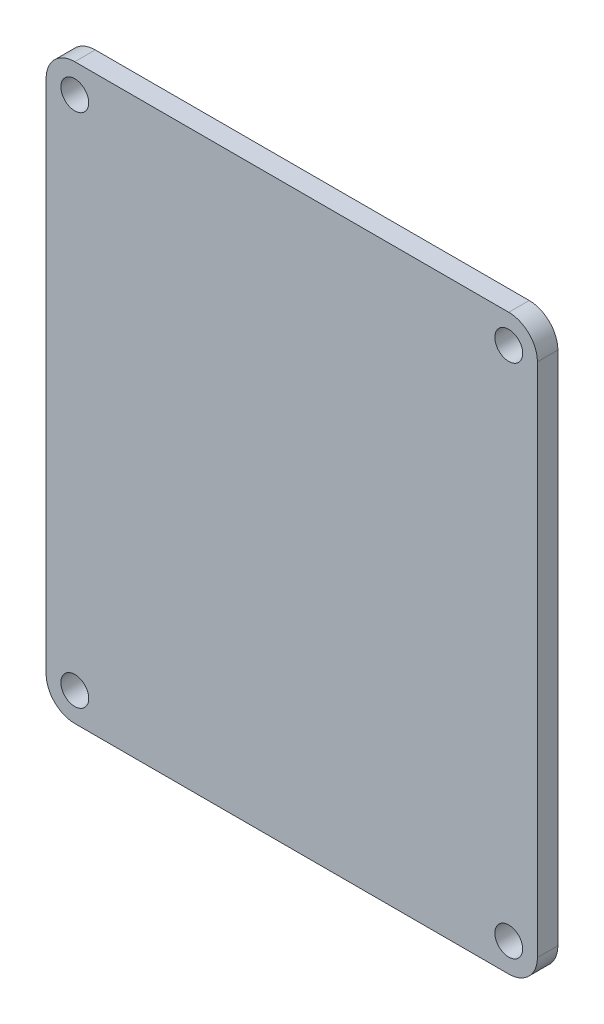
ISO-10303-21;
HEADER;
FILE_DESCRIPTION(('STEP AP214'),'2;1');
FILE_NAME('part.step','',(''),(''),'','','');
FILE_SCHEMA(('AUTOMOTIVE_DESIGN { 1 0 10303 214 1 1 1 1 }'));
ENDSEC;
DATA;
#1=APPLICATION_CONTEXT('core data for automotive mechanical design processes');
#2=APPLICATION_PROTOCOL_DEFINITION('international standard','automotive_design',2000,#1);
#3=PRODUCT_CONTEXT('',#1,'mechanical');
#4=PRODUCT('Part','Part','',(#3));
#5=PRODUCT_RELATED_PRODUCT_CATEGORY('part','',(#4));
#6=PRODUCT_DEFINITION_FORMATION('','',#4);
#7=PRODUCT_DEFINITION_CONTEXT('part definition',#1,'design');
#8=PRODUCT_DEFINITION('design','',#6,#7);
#9=PRODUCT_DEFINITION_SHAPE('','',#8);
#10=(LENGTH_UNIT() NAMED_UNIT(*) SI_UNIT(.MILLI.,.METRE.));
#11=(NAMED_UNIT(*) PLANE_ANGLE_UNIT() SI_UNIT($,.RADIAN.));
#12=(NAMED_UNIT(*) SI_UNIT($,.STERADIAN.) SOLID_ANGLE_UNIT());
#13=UNCERTAINTY_MEASURE_WITH_UNIT(LENGTH_MEASURE(1.E-05),#10,'distance_accuracy_value','');
#14=(GEOMETRIC_REPRESENTATION_CONTEXT(3) GLOBAL_UNCERTAINTY_ASSIGNED_CONTEXT((#13)) GLOBAL_UNIT_ASSIGNED_CONTEXT((#10,
#11,#12)) REPRESENTATION_CONTEXT('',''));
#15=CARTESIAN_POINT('',(0.,0.,0.));
#16=DIRECTION('',(0.,0.,1.));
#17=DIRECTION('',(1.,0.,0.));
#18=AXIS2_PLACEMENT_3D('',#15,#16,#17);
#19=CARTESIAN_POINT('',(-26.5,-31.5,2.5));
#20=DIRECTION('',(0.,0.,-1.));
#21=DIRECTION('',(-1.,0.,0.));
#22=AXIS2_PLACEMENT_3D('',#19,#20,#21);
#23=PLANE('',#22);
#24=CARTESIAN_POINT('',(-26.5,-31.5,2.5));
#25=DIRECTION('',(0.,0.,1.));
#26=DIRECTION('',(-1.,0.,0.));
#27=AXIS2_PLACEMENT_3D('',#24,#25,#26);
#28=CIRCLE('',#27,3.5);
#29=CARTESIAN_POINT('',(-30.,-31.5,2.5));
#30=VERTEX_POINT('',#29);
#31=CARTESIAN_POINT('',(-26.5,-35.,2.5));
#32=VERTEX_POINT('',#31);
#33=EDGE_CURVE('E151',#30,#32,#28,.T.);
#34=ORIENTED_EDGE('',*,*,#33,.T.);
#35=DIRECTION('',(1.,0.,0.));
#36=VECTOR('',#35,1.);
#37=CARTESIAN_POINT('',(26.5,-35.,2.5));
#38=LINE('',#37,#36);
#39=CARTESIAN_POINT('',(26.5,-35.,2.5));
#40=VERTEX_POINT('',#39);
#41=EDGE_CURVE('E98',#32,#40,#38,.T.);
#42=ORIENTED_EDGE('',*,*,#41,.T.);
#43=CARTESIAN_POINT('',(26.5,-31.5,2.5));
#44=DIRECTION('',(0.,0.,1.));
#45=DIRECTION('',(-1.,0.,0.));
#46=AXIS2_PLACEMENT_3D('',#43,#44,#45);
#47=CIRCLE('',#46,3.5);
#48=CARTESIAN_POINT('',(30.,-31.5,2.5));
#49=VERTEX_POINT('',#48);
#50=EDGE_CURVE('E168',#40,#49,#47,.T.);
#51=ORIENTED_EDGE('',*,*,#50,.T.);
#52=DIRECTION('',(0.,1.,0.));
#53=VECTOR('',#52,1.);
#54=CARTESIAN_POINT('',(30.,-31.5,2.5));
#55=LINE('',#54,#53);
#56=CARTESIAN_POINT('',(30.,31.5,2.5));
#57=VERTEX_POINT('',#56);
#58=EDGE_CURVE('E177',#49,#57,#55,.T.);
#59=ORIENTED_EDGE('',*,*,#58,.T.);
#60=CARTESIAN_POINT('',(26.5,31.5,2.5));
#61=DIRECTION('',(0.,0.,1.));
#62=DIRECTION('',(1.,0.,0.));
#63=AXIS2_PLACEMENT_3D('',#60,#61,#62);
#64=CIRCLE('',#63,3.5);
#65=CARTESIAN_POINT('',(26.5,35.,2.5));
#66=VERTEX_POINT('',#65);
#67=EDGE_CURVE('E119',#57,#66,#64,.T.);
#68=ORIENTED_EDGE('',*,*,#67,.T.);
#69=DIRECTION('',(-1.,0.,0.));
#70=VECTOR('',#69,1.);
#71=CARTESIAN_POINT('',(26.5,35.,2.5));
#72=LINE('',#71,#70);
#73=CARTESIAN_POINT('',(-26.5,35.,2.5));
#74=VERTEX_POINT('',#73);
#75=EDGE_CURVE('E115',#66,#74,#72,.T.);
#76=ORIENTED_EDGE('',*,*,#75,.T.);
#77=CARTESIAN_POINT('',(-26.5,31.5,2.5));
#78=DIRECTION('',(0.,0.,1.));
#79=DIRECTION('',(-1.,0.,0.));
#80=AXIS2_PLACEMENT_3D('',#77,#78,#79);
#81=CIRCLE('',#80,3.5);
#82=CARTESIAN_POINT('',(-30.,31.5,2.5));
#83=VERTEX_POINT('',#82);
#84=EDGE_CURVE('E116',#74,#83,#81,.T.);
#85=ORIENTED_EDGE('',*,*,#84,.T.);
#86=DIRECTION('',(0.,-1.,0.));
#87=VECTOR('',#86,1.);
#88=CARTESIAN_POINT('',(-30.,-31.5,2.5));
#89=LINE('',#88,#87);
#90=EDGE_CURVE('E57',#83,#30,#89,.T.);
#91=ORIENTED_EDGE('',*,*,#90,.T.);
#92=EDGE_LOOP('',(#34,#42,#51,#59,#68,#76,#85,#91));
#93=FACE_BOUND('',#92,.T.);
#94=CARTESIAN_POINT('',(26.5,-31.5,2.5));
#95=DIRECTION('',(0.,0.,1.));
#96=DIRECTION('',(1.,0.,0.));
#97=AXIS2_PLACEMENT_3D('',#94,#95,#96);
#98=CIRCLE('',#97,1.7);
#99=CARTESIAN_POINT('',(28.2,-31.5,2.5));
#100=VERTEX_POINT('',#99);
#101=EDGE_CURVE('E139',#100,#100,#98,.T.);
#102=ORIENTED_EDGE('',*,*,#101,.F.);
#103=EDGE_LOOP('',(#102));
#104=FACE_BOUND('',#103,.T.);
#105=CARTESIAN_POINT('',(-26.5,-31.5,2.5));
#106=DIRECTION('',(0.,0.,1.));
#107=DIRECTION('',(1.,0.,0.));
#108=AXIS2_PLACEMENT_3D('',#105,#106,#107);
#109=CIRCLE('',#108,1.7);
#110=CARTESIAN_POINT('',(-24.8,-31.5,2.5));
#111=VERTEX_POINT('',#110);
#112=EDGE_CURVE('E187',#111,#111,#109,.T.);
#113=ORIENTED_EDGE('',*,*,#112,.F.);
#114=EDGE_LOOP('',(#113));
#115=FACE_BOUND('',#114,.T.);
#116=CARTESIAN_POINT('',(-26.5,31.5,2.5));
#117=DIRECTION('',(0.,0.,1.));
#118=DIRECTION('',(1.,0.,0.));
#119=AXIS2_PLACEMENT_3D('',#116,#117,#118);
#120=CIRCLE('',#119,1.7);
#121=CARTESIAN_POINT('',(-24.8,31.5,2.5));
#122=VERTEX_POINT('',#121);
#123=EDGE_CURVE('E191',#122,#122,#120,.T.);
#124=ORIENTED_EDGE('',*,*,#123,.F.);
#125=EDGE_LOOP('',(#124));
#126=FACE_BOUND('',#125,.T.);
#127=CARTESIAN_POINT('',(26.5,31.5,2.5));
#128=DIRECTION('',(0.,0.,1.));
#129=DIRECTION('',(1.,0.,0.));
#130=AXIS2_PLACEMENT_3D('',#127,#128,#129);
#131=CIRCLE('',#130,1.7);
#132=CARTESIAN_POINT('',(28.2,31.5,2.5));
#133=VERTEX_POINT('',#132);
#134=EDGE_CURVE('E200',#133,#133,#131,.T.);
#135=ORIENTED_EDGE('',*,*,#134,.F.);
#136=EDGE_LOOP('',(#135));
#137=FACE_BOUND('',#136,.T.);
#138=ADVANCED_FACE('F39',(#93,#104,#115,#126,#137),#23,.F.);
#139=CARTESIAN_POINT('',(-26.5,-31.5,0.));
#140=DIRECTION('',(0.,0.,-1.));
#141=DIRECTION('',(-1.,0.,0.));
#142=AXIS2_PLACEMENT_3D('',#139,#140,#141);
#143=PLANE('',#142);
#144=CARTESIAN_POINT('',(-26.5,31.5,0.));
#145=DIRECTION('',(0.,0.,1.));
#146=DIRECTION('',(1.,0.,0.));
#147=AXIS2_PLACEMENT_3D('',#144,#145,#146);
#148=CIRCLE('',#147,1.7);
#149=CARTESIAN_POINT('',(-24.8,31.5,0.));
#150=VERTEX_POINT('',#149);
#151=EDGE_CURVE('E197',#150,#150,#148,.T.);
#152=ORIENTED_EDGE('',*,*,#151,.T.);
#153=EDGE_LOOP('',(#152));
#154=FACE_BOUND('',#153,.T.);
#155=CARTESIAN_POINT('',(26.5,-31.5,0.));
#156=DIRECTION('',(0.,0.,1.));
#157=DIRECTION('',(1.,0.,0.));
#158=AXIS2_PLACEMENT_3D('',#155,#156,#157);
#159=CIRCLE('',#158,1.7);
#160=CARTESIAN_POINT('',(28.2,-31.5,0.));
#161=VERTEX_POINT('',#160);
#162=EDGE_CURVE('E184',#161,#161,#159,.T.);
#163=ORIENTED_EDGE('',*,*,#162,.T.);
#164=EDGE_LOOP('',(#163));
#165=FACE_BOUND('',#164,.T.);
#166=CARTESIAN_POINT('',(-26.5,-31.5,0.));
#167=DIRECTION('',(0.,0.,1.));
#168=DIRECTION('',(-1.,0.,0.));
#169=AXIS2_PLACEMENT_3D('',#166,#167,#168);
#170=CIRCLE('',#169,3.5);
#171=CARTESIAN_POINT('',(-30.,-31.5,0.));
#172=VERTEX_POINT('',#171);
#173=CARTESIAN_POINT('',(-26.5,-35.,0.));
#174=VERTEX_POINT('',#173);
#175=EDGE_CURVE('E136',#172,#174,#170,.T.);
#176=ORIENTED_EDGE('',*,*,#175,.F.);
#177=DIRECTION('',(0.,-1.,0.));
#178=VECTOR('',#177,1.);
#179=CARTESIAN_POINT('',(-30.,-31.5,0.));
#180=LINE('',#179,#178);
#181=CARTESIAN_POINT('',(-30.,31.5,0.));
#182=VERTEX_POINT('',#181);
#183=EDGE_CURVE('E91',#182,#172,#180,.T.);
#184=ORIENTED_EDGE('',*,*,#183,.F.);
#185=CARTESIAN_POINT('',(-26.5,31.5,0.));
#186=DIRECTION('',(0.,0.,1.));
#187=DIRECTION('',(-1.,0.,0.));
#188=AXIS2_PLACEMENT_3D('',#185,#186,#187);
#189=CIRCLE('',#188,3.5);
#190=CARTESIAN_POINT('',(-26.5,35.,0.));
#191=VERTEX_POINT('',#190);
#192=EDGE_CURVE('E82',#191,#182,#189,.T.);
#193=ORIENTED_EDGE('',*,*,#192,.F.);
#194=DIRECTION('',(-1.,0.,0.));
#195=VECTOR('',#194,1.);
#196=CARTESIAN_POINT('',(26.5,35.,0.));
#197=LINE('',#196,#195);
#198=CARTESIAN_POINT('',(26.5,35.,0.));
#199=VERTEX_POINT('',#198);
#200=EDGE_CURVE('E128',#199,#191,#197,.T.);
#201=ORIENTED_EDGE('',*,*,#200,.F.);
#202=CARTESIAN_POINT('',(26.5,31.5,0.));
#203=DIRECTION('',(0.,0.,1.));
#204=DIRECTION('',(1.,0.,0.));
#205=AXIS2_PLACEMENT_3D('',#202,#203,#204);
#206=CIRCLE('',#205,3.5);
#207=CARTESIAN_POINT('',(30.,31.5,0.));
#208=VERTEX_POINT('',#207);
#209=EDGE_CURVE('E147',#208,#199,#206,.T.);
#210=ORIENTED_EDGE('',*,*,#209,.F.);
#211=DIRECTION('',(0.,1.,0.));
#212=VECTOR('',#211,1.);
#213=CARTESIAN_POINT('',(30.,-31.5,0.));
#214=LINE('',#213,#212);
#215=CARTESIAN_POINT('',(30.,-31.5,0.));
#216=VERTEX_POINT('',#215);
#217=EDGE_CURVE('E143',#216,#208,#214,.T.);
#218=ORIENTED_EDGE('',*,*,#217,.F.);
#219=CARTESIAN_POINT('',(26.5,-31.5,0.));
#220=DIRECTION('',(0.,0.,1.));
#221=DIRECTION('',(-1.,0.,0.));
#222=AXIS2_PLACEMENT_3D('',#219,#220,#221);
#223=CIRCLE('',#222,3.5);
#224=CARTESIAN_POINT('',(26.5,-35.,0.));
#225=VERTEX_POINT('',#224);
#226=EDGE_CURVE('E145',#225,#216,#223,.T.);
#227=ORIENTED_EDGE('',*,*,#226,.F.);
#228=DIRECTION('',(1.,0.,0.));
#229=VECTOR('',#228,1.);
#230=CARTESIAN_POINT('',(26.5,-35.,0.));
#231=LINE('',#230,#229);
#232=EDGE_CURVE('E137',#174,#225,#231,.T.);
#233=ORIENTED_EDGE('',*,*,#232,.F.);
#234=EDGE_LOOP('',(#176,#184,#193,#201,#210,#218,#227,#233));
#235=FACE_BOUND('',#234,.T.);
#236=CARTESIAN_POINT('',(-26.5,-31.5,0.));
#237=DIRECTION('',(0.,0.,1.));
#238=DIRECTION('',(1.,0.,0.));
#239=AXIS2_PLACEMENT_3D('',#236,#237,#238);
#240=CIRCLE('',#239,1.7);
#241=CARTESIAN_POINT('',(-24.8,-31.5,0.));
#242=VERTEX_POINT('',#241);
#243=EDGE_CURVE('E192',#242,#242,#240,.T.);
#244=ORIENTED_EDGE('',*,*,#243,.T.);
#245=EDGE_LOOP('',(#244));
#246=FACE_BOUND('',#245,.T.);
#247=CARTESIAN_POINT('',(26.5,31.5,0.));
#248=DIRECTION('',(0.,0.,1.));
#249=DIRECTION('',(1.,0.,0.));
#250=AXIS2_PLACEMENT_3D('',#247,#248,#249);
#251=CIRCLE('',#250,1.7);
#252=CARTESIAN_POINT('',(28.2,31.5,0.));
#253=VERTEX_POINT('',#252);
#254=EDGE_CURVE('E201',#253,#253,#251,.T.);
#255=ORIENTED_EDGE('',*,*,#254,.T.);
#256=EDGE_LOOP('',(#255));
#257=FACE_BOUND('',#256,.T.);
#258=ADVANCED_FACE('F169',(#154,#165,#235,#246,#257),#143,.T.);
#259=CARTESIAN_POINT('',(-26.5,-31.5,2.5));
#260=DIRECTION('',(0.,0.,-1.));
#261=DIRECTION('',(-1.,0.,0.));
#262=AXIS2_PLACEMENT_3D('',#259,#260,#261);
#263=CYLINDRICAL_SURFACE('',#262,3.5);
#264=ORIENTED_EDGE('',*,*,#175,.T.);
#265=DIRECTION('',(0.,0.,-1.));
#266=VECTOR('',#265,1.);
#267=CARTESIAN_POINT('',(-26.5,-35.,2.5));
#268=LINE('',#267,#266);
#269=EDGE_CURVE('E11',#32,#174,#268,.T.);
#270=ORIENTED_EDGE('',*,*,#269,.F.);
#271=ORIENTED_EDGE('',*,*,#33,.F.);
#272=DIRECTION('',(0.,0.,-1.));
#273=VECTOR('',#272,1.);
#274=CARTESIAN_POINT('',(-30.,-31.5,2.5));
#275=LINE('',#274,#273);
#276=EDGE_CURVE('E135',#30,#172,#275,.T.);
#277=ORIENTED_EDGE('',*,*,#276,.T.);
#278=EDGE_LOOP('',(#264,#270,#271,#277));
#279=FACE_BOUND('',#278,.T.);
#280=ADVANCED_FACE('F41',(#279),#263,.T.);
#281=CARTESIAN_POINT('',(26.5,-35.,2.5));
#282=DIRECTION('',(0.,1.,0.));
#283=DIRECTION('',(0.,0.,1.));
#284=AXIS2_PLACEMENT_3D('',#281,#282,#283);
#285=PLANE('',#284);
#286=ORIENTED_EDGE('',*,*,#232,.T.);
#287=DIRECTION('',(0.,0.,-1.));
#288=VECTOR('',#287,1.);
#289=CARTESIAN_POINT('',(26.5,-35.,2.5));
#290=LINE('',#289,#288);
#291=EDGE_CURVE('E48',#40,#225,#290,.T.);
#292=ORIENTED_EDGE('',*,*,#291,.F.);
#293=ORIENTED_EDGE('',*,*,#41,.F.);
#294=ORIENTED_EDGE('',*,*,#269,.T.);
#295=EDGE_LOOP('',(#286,#292,#293,#294));
#296=FACE_BOUND('',#295,.T.);
#297=ADVANCED_FACE('F234',(#296),#285,.F.);
#298=CARTESIAN_POINT('',(26.5,-31.5,2.5));
#299=DIRECTION('',(0.,0.,-1.));
#300=DIRECTION('',(-1.,0.,0.));
#301=AXIS2_PLACEMENT_3D('',#298,#299,#300);
#302=CYLINDRICAL_SURFACE('',#301,3.5);
#303=ORIENTED_EDGE('',*,*,#226,.T.);
#304=DIRECTION('',(0.,0.,-1.));
#305=VECTOR('',#304,1.);
#306=CARTESIAN_POINT('',(30.,-31.5,2.5));
#307=LINE('',#306,#305);
#308=EDGE_CURVE('E156',#49,#216,#307,.T.);
#309=ORIENTED_EDGE('',*,*,#308,.F.);
#310=ORIENTED_EDGE('',*,*,#50,.F.);
#311=ORIENTED_EDGE('',*,*,#291,.T.);
#312=EDGE_LOOP('',(#303,#309,#310,#311));
#313=FACE_BOUND('',#312,.T.);
#314=ADVANCED_FACE('F163',(#313),#302,.T.);
#315=CARTESIAN_POINT('',(30.,-31.5,2.5));
#316=DIRECTION('',(-1.,0.,0.));
#317=DIRECTION('',(0.,0.,1.));
#318=AXIS2_PLACEMENT_3D('',#315,#316,#317);
#319=PLANE('',#318);
#320=ORIENTED_EDGE('',*,*,#217,.T.);
#321=DIRECTION('',(0.,0.,-1.));
#322=VECTOR('',#321,1.);
#323=CARTESIAN_POINT('',(30.,31.5,2.5));
#324=LINE('',#323,#322);
#325=EDGE_CURVE('E155',#57,#208,#324,.T.);
#326=ORIENTED_EDGE('',*,*,#325,.F.);
#327=ORIENTED_EDGE('',*,*,#58,.F.);
#328=ORIENTED_EDGE('',*,*,#308,.T.);
#329=EDGE_LOOP('',(#320,#326,#327,#328));
#330=FACE_BOUND('',#329,.T.);
#331=ADVANCED_FACE('F172',(#330),#319,.F.);
#332=CARTESIAN_POINT('',(26.5,31.5,2.5));
#333=DIRECTION('',(0.,0.,-1.));
#334=DIRECTION('',(-1.,0.,0.));
#335=AXIS2_PLACEMENT_3D('',#332,#333,#334);
#336=CYLINDRICAL_SURFACE('',#335,3.5);
#337=ORIENTED_EDGE('',*,*,#209,.T.);
#338=DIRECTION('',(0.,0.,-1.));
#339=VECTOR('',#338,1.);
#340=CARTESIAN_POINT('',(26.5,35.,2.5));
#341=LINE('',#340,#339);
#342=EDGE_CURVE('E130',#66,#199,#341,.T.);
#343=ORIENTED_EDGE('',*,*,#342,.F.);
#344=ORIENTED_EDGE('',*,*,#67,.F.);
#345=ORIENTED_EDGE('',*,*,#325,.T.);
#346=EDGE_LOOP('',(#337,#343,#344,#345));
#347=FACE_BOUND('',#346,.T.);
#348=ADVANCED_FACE('F178',(#347),#336,.T.);
#349=CARTESIAN_POINT('',(26.5,35.,2.5));
#350=DIRECTION('',(0.,-1.,0.));
#351=DIRECTION('',(0.,0.,-1.));
#352=AXIS2_PLACEMENT_3D('',#349,#350,#351);
#353=PLANE('',#352);
#354=ORIENTED_EDGE('',*,*,#200,.T.);
#355=DIRECTION('',(0.,0.,-1.));
#356=VECTOR('',#355,1.);
#357=CARTESIAN_POINT('',(-26.5,35.,2.5));
#358=LINE('',#357,#356);
#359=EDGE_CURVE('E121',#74,#191,#358,.T.);
#360=ORIENTED_EDGE('',*,*,#359,.F.);
#361=ORIENTED_EDGE('',*,*,#75,.F.);
#362=ORIENTED_EDGE('',*,*,#342,.T.);
#363=EDGE_LOOP('',(#354,#360,#361,#362));
#364=FACE_BOUND('',#363,.T.);
#365=ADVANCED_FACE('F125',(#364),#353,.F.);
#366=CARTESIAN_POINT('',(-26.5,31.5,2.5));
#367=DIRECTION('',(0.,0.,-1.));
#368=DIRECTION('',(-1.,0.,0.));
#369=AXIS2_PLACEMENT_3D('',#366,#367,#368);
#370=CYLINDRICAL_SURFACE('',#369,3.5);
#371=ORIENTED_EDGE('',*,*,#192,.T.);
#372=DIRECTION('',(0.,0.,-1.));
#373=VECTOR('',#372,1.);
#374=CARTESIAN_POINT('',(-30.,31.5,2.5));
#375=LINE('',#374,#373);
#376=EDGE_CURVE('E126',#83,#182,#375,.T.);
#377=ORIENTED_EDGE('',*,*,#376,.F.);
#378=ORIENTED_EDGE('',*,*,#84,.F.);
#379=ORIENTED_EDGE('',*,*,#359,.T.);
#380=EDGE_LOOP('',(#371,#377,#378,#379));
#381=FACE_BOUND('',#380,.T.);
#382=ADVANCED_FACE('F127',(#381),#370,.T.);
#383=CARTESIAN_POINT('',(-30.,-31.5,2.5));
#384=DIRECTION('',(1.,0.,0.));
#385=DIRECTION('',(0.,0.,-1.));
#386=AXIS2_PLACEMENT_3D('',#383,#384,#385);
#387=PLANE('',#386);
#388=ORIENTED_EDGE('',*,*,#183,.T.);
#389=ORIENTED_EDGE('',*,*,#276,.F.);
#390=ORIENTED_EDGE('',*,*,#90,.F.);
#391=ORIENTED_EDGE('',*,*,#376,.T.);
#392=EDGE_LOOP('',(#388,#389,#390,#391));
#393=FACE_BOUND('',#392,.T.);
#394=ADVANCED_FACE('F223',(#393),#387,.F.);
#395=CARTESIAN_POINT('',(26.5,-31.5,2.5));
#396=DIRECTION('',(0.,0.,-1.));
#397=DIRECTION('',(-1.,0.,0.));
#398=AXIS2_PLACEMENT_3D('',#395,#396,#397);
#399=CYLINDRICAL_SURFACE('',#398,1.7);
#400=ORIENTED_EDGE('',*,*,#101,.T.);
#401=EDGE_LOOP('',(#400));
#402=FACE_BOUND('',#401,.T.);
#403=ORIENTED_EDGE('',*,*,#162,.F.);
#404=EDGE_LOOP('',(#403));
#405=FACE_BOUND('',#404,.T.);
#406=ADVANCED_FACE('F217',(#402,#405),#399,.F.);
#407=CARTESIAN_POINT('',(-26.5,-31.5,2.5));
#408=DIRECTION('',(0.,0.,-1.));
#409=DIRECTION('',(-1.,0.,0.));
#410=AXIS2_PLACEMENT_3D('',#407,#408,#409);
#411=CYLINDRICAL_SURFACE('',#410,1.7);
#412=ORIENTED_EDGE('',*,*,#112,.T.);
#413=EDGE_LOOP('',(#412));
#414=FACE_BOUND('',#413,.T.);
#415=ORIENTED_EDGE('',*,*,#243,.F.);
#416=EDGE_LOOP('',(#415));
#417=FACE_BOUND('',#416,.T.);
#418=ADVANCED_FACE('F299',(#414,#417),#411,.F.);
#419=CARTESIAN_POINT('',(-26.5,31.5,2.5));
#420=DIRECTION('',(0.,0.,-1.));
#421=DIRECTION('',(-1.,0.,0.));
#422=AXIS2_PLACEMENT_3D('',#419,#420,#421);
#423=CYLINDRICAL_SURFACE('',#422,1.7);
#424=ORIENTED_EDGE('',*,*,#123,.T.);
#425=EDGE_LOOP('',(#424));
#426=FACE_BOUND('',#425,.T.);
#427=ORIENTED_EDGE('',*,*,#151,.F.);
#428=EDGE_LOOP('',(#427));
#429=FACE_BOUND('',#428,.T.);
#430=ADVANCED_FACE('F308',(#426,#429),#423,.F.);
#431=CARTESIAN_POINT('',(26.5,31.5,2.5));
#432=DIRECTION('',(0.,0.,-1.));
#433=DIRECTION('',(-1.,0.,0.));
#434=AXIS2_PLACEMENT_3D('',#431,#432,#433);
#435=CYLINDRICAL_SURFACE('',#434,1.7);
#436=ORIENTED_EDGE('',*,*,#134,.T.);
#437=EDGE_LOOP('',(#436));
#438=FACE_BOUND('',#437,.T.);
#439=ORIENTED_EDGE('',*,*,#254,.F.);
#440=EDGE_LOOP('',(#439));
#441=FACE_BOUND('',#440,.T.);
#442=ADVANCED_FACE('F208',(#438,#441),#435,.F.);
#443=CLOSED_SHELL('',(#138,#258,#280,#297,#314,#331,#348,#365,#382,#394,#406,#418,#430,#442));
#444=MANIFOLD_SOLID_BREP('B2',#443);
#445=ADVANCED_BREP_SHAPE_REPRESENTATION('',(#18,#444),#14);
#446=SHAPE_DEFINITION_REPRESENTATION(#9,#445);
ENDSEC;
END-ISO-10303-21;
